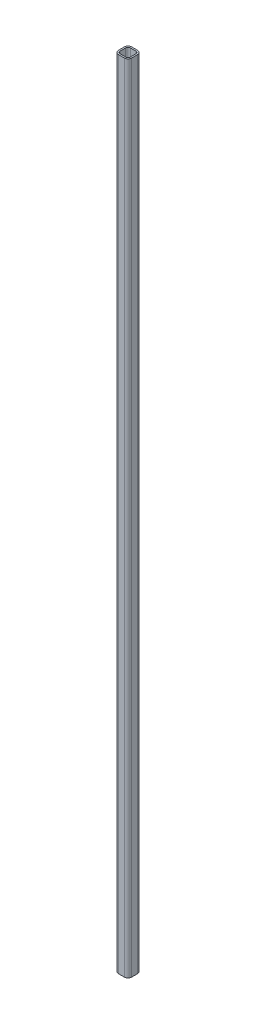
ISO-10303-21;
HEADER;
FILE_DESCRIPTION(('STEP AP214'),'2;1');
FILE_NAME('part.step','',(''),(''),'','','');
FILE_SCHEMA(('AUTOMOTIVE_DESIGN { 1 0 10303 214 1 1 1 1 }'));
ENDSEC;
DATA;
#1=APPLICATION_CONTEXT('core data for automotive mechanical design processes');
#2=APPLICATION_PROTOCOL_DEFINITION('international standard','automotive_design',2000,#1);
#3=PRODUCT_CONTEXT('',#1,'mechanical');
#4=PRODUCT('Part','Part','',(#3));
#5=PRODUCT_RELATED_PRODUCT_CATEGORY('part','',(#4));
#6=PRODUCT_DEFINITION_FORMATION('','',#4);
#7=PRODUCT_DEFINITION_CONTEXT('part definition',#1,'design');
#8=PRODUCT_DEFINITION('design','',#6,#7);
#9=PRODUCT_DEFINITION_SHAPE('','',#8);
#10=(LENGTH_UNIT() NAMED_UNIT(*) SI_UNIT(.MILLI.,.METRE.));
#11=(NAMED_UNIT(*) PLANE_ANGLE_UNIT() SI_UNIT($,.RADIAN.));
#12=(NAMED_UNIT(*) SI_UNIT($,.STERADIAN.) SOLID_ANGLE_UNIT());
#13=UNCERTAINTY_MEASURE_WITH_UNIT(LENGTH_MEASURE(1.E-05),#10,'distance_accuracy_value','');
#14=(GEOMETRIC_REPRESENTATION_CONTEXT(3) GLOBAL_UNCERTAINTY_ASSIGNED_CONTEXT((#13)) GLOBAL_UNIT_ASSIGNED_CONTEXT((#10,
#11,#12)) REPRESENTATION_CONTEXT('',''));
#15=CARTESIAN_POINT('',(0.,0.,0.));
#16=DIRECTION('',(0.,0.,1.));
#17=DIRECTION('',(1.,0.,0.));
#18=AXIS2_PLACEMENT_3D('',#15,#16,#17);
#19=CARTESIAN_POINT('',(11.,-90.,-11.));
#20=DIRECTION('',(1.,0.,0.));
#21=DIRECTION('',(0.,0.,-1.));
#22=AXIS2_PLACEMENT_3D('',#19,#20,#21);
#23=PLANE('',#22);
#24=DIRECTION('',(0.,0.,-1.));
#25=VECTOR('',#24,1.);
#26=CARTESIAN_POINT('',(11.,1100.,-11.));
#27=LINE('',#26,#25);
#28=CARTESIAN_POINT('',(11.,1100.,5.));
#29=VERTEX_POINT('',#28);
#30=CARTESIAN_POINT('',(11.,1100.,-5.));
#31=VERTEX_POINT('',#30);
#32=EDGE_CURVE('E329',#29,#31,#27,.T.);
#33=ORIENTED_EDGE('',*,*,#32,.F.);
#34=DIRECTION('',(0.,1.,0.));
#35=VECTOR('',#34,1.);
#36=CARTESIAN_POINT('',(11.,-90.,5.));
#37=LINE('',#36,#35);
#38=CARTESIAN_POINT('',(11.,-220.,5.));
#39=VERTEX_POINT('',#38);
#40=EDGE_CURVE('E219',#29,#39,#37,.F.);
#41=ORIENTED_EDGE('',*,*,#40,.T.);
#42=DIRECTION('',(0.,0.,1.));
#43=VECTOR('',#42,1.);
#44=CARTESIAN_POINT('',(11.,-220.,11.));
#45=LINE('',#44,#43);
#46=CARTESIAN_POINT('',(11.,-220.,-5.));
#47=VERTEX_POINT('',#46);
#48=EDGE_CURVE('E321',#47,#39,#45,.T.);
#49=ORIENTED_EDGE('',*,*,#48,.F.);
#50=DIRECTION('',(0.,1.,0.));
#51=VECTOR('',#50,1.);
#52=CARTESIAN_POINT('',(11.,-90.,-5.));
#53=LINE('',#52,#51);
#54=EDGE_CURVE('E215',#47,#31,#53,.T.);
#55=ORIENTED_EDGE('',*,*,#54,.T.);
#56=EDGE_LOOP('',(#33,#41,#49,#55));
#57=FACE_BOUND('',#56,.T.);
#58=ADVANCED_FACE('F39',(#57),#23,.T.);
#59=CARTESIAN_POINT('',(-11.,-90.,11.));
#60=DIRECTION('',(0.,0.,1.));
#61=DIRECTION('',(1.,0.,0.));
#62=AXIS2_PLACEMENT_3D('',#59,#60,#61);
#63=PLANE('',#62);
#64=DIRECTION('',(1.,0.,0.));
#65=VECTOR('',#64,1.);
#66=CARTESIAN_POINT('',(-11.,1100.,11.));
#67=LINE('',#66,#65);
#68=CARTESIAN_POINT('',(-5.,1100.,11.));
#69=VERTEX_POINT('',#68);
#70=CARTESIAN_POINT('',(5.,1100.,11.));
#71=VERTEX_POINT('',#70);
#72=EDGE_CURVE('E177',#69,#71,#67,.T.);
#73=ORIENTED_EDGE('',*,*,#72,.F.);
#74=DIRECTION('',(0.,1.,0.));
#75=VECTOR('',#74,1.);
#76=CARTESIAN_POINT('',(-5.,-90.,11.));
#77=LINE('',#76,#75);
#78=CARTESIAN_POINT('',(-5.,-220.,11.));
#79=VERTEX_POINT('',#78);
#80=EDGE_CURVE('E201',#69,#79,#77,.F.);
#81=ORIENTED_EDGE('',*,*,#80,.T.);
#82=DIRECTION('',(-1.,0.,0.));
#83=VECTOR('',#82,1.);
#84=CARTESIAN_POINT('',(-11.,-220.,11.));
#85=LINE('',#84,#83);
#86=CARTESIAN_POINT('',(5.,-220.,11.));
#87=VERTEX_POINT('',#86);
#88=EDGE_CURVE('E325',#87,#79,#85,.T.);
#89=ORIENTED_EDGE('',*,*,#88,.F.);
#90=DIRECTION('',(0.,1.,0.));
#91=VECTOR('',#90,1.);
#92=CARTESIAN_POINT('',(5.,-90.,11.));
#93=LINE('',#92,#91);
#94=EDGE_CURVE('E197',#87,#71,#93,.T.);
#95=ORIENTED_EDGE('',*,*,#94,.T.);
#96=EDGE_LOOP('',(#73,#81,#89,#95));
#97=FACE_BOUND('',#96,.T.);
#98=ADVANCED_FACE('F347',(#97),#63,.T.);
#99=CARTESIAN_POINT('',(-11.,-90.,-11.));
#100=DIRECTION('',(-1.,0.,0.));
#101=DIRECTION('',(0.,0.,1.));
#102=AXIS2_PLACEMENT_3D('',#99,#100,#101);
#103=PLANE('',#102);
#104=DIRECTION('',(0.,0.,-1.));
#105=VECTOR('',#104,1.);
#106=CARTESIAN_POINT('',(-11.,-220.,11.));
#107=LINE('',#106,#105);
#108=CARTESIAN_POINT('',(-11.,-220.,4.99999999999999));
#109=VERTEX_POINT('',#108);
#110=CARTESIAN_POINT('',(-11.,-220.,-5.));
#111=VERTEX_POINT('',#110);
#112=EDGE_CURVE('E298',#109,#111,#107,.T.);
#113=ORIENTED_EDGE('',*,*,#112,.F.);
#114=DIRECTION('',(0.,1.,0.));
#115=VECTOR('',#114,1.);
#116=CARTESIAN_POINT('',(-11.,-90.,5.));
#117=LINE('',#116,#115);
#118=CARTESIAN_POINT('',(-11.,1100.,5.));
#119=VERTEX_POINT('',#118);
#120=EDGE_CURVE('E175',#109,#119,#117,.T.);
#121=ORIENTED_EDGE('',*,*,#120,.T.);
#122=DIRECTION('',(0.,0.,1.));
#123=VECTOR('',#122,1.);
#124=CARTESIAN_POINT('',(-11.,1100.,-11.));
#125=LINE('',#124,#123);
#126=CARTESIAN_POINT('',(-11.,1100.,-5.));
#127=VERTEX_POINT('',#126);
#128=EDGE_CURVE('E157',#127,#119,#125,.T.);
#129=ORIENTED_EDGE('',*,*,#128,.F.);
#130=DIRECTION('',(0.,1.,0.));
#131=VECTOR('',#130,1.);
#132=CARTESIAN_POINT('',(-11.,-90.,-5.));
#133=LINE('',#132,#131);
#134=EDGE_CURVE('E172',#127,#111,#133,.F.);
#135=ORIENTED_EDGE('',*,*,#134,.T.);
#136=EDGE_LOOP('',(#113,#121,#129,#135));
#137=FACE_BOUND('',#136,.T.);
#138=ADVANCED_FACE('F171',(#137),#103,.T.);
#139=CARTESIAN_POINT('',(-11.,-90.,-11.));
#140=DIRECTION('',(0.,0.,-1.));
#141=DIRECTION('',(-1.,0.,0.));
#142=AXIS2_PLACEMENT_3D('',#139,#140,#141);
#143=PLANE('',#142);
#144=DIRECTION('',(1.,0.,0.));
#145=VECTOR('',#144,1.);
#146=CARTESIAN_POINT('',(-11.,-220.,-11.));
#147=LINE('',#146,#145);
#148=CARTESIAN_POINT('',(-5.,-220.,-11.));
#149=VERTEX_POINT('',#148);
#150=CARTESIAN_POINT('',(5.,-220.,-11.));
#151=VERTEX_POINT('',#150);
#152=EDGE_CURVE('E302',#149,#151,#147,.T.);
#153=ORIENTED_EDGE('',*,*,#152,.F.);
#154=DIRECTION('',(0.,1.,0.));
#155=VECTOR('',#154,1.);
#156=CARTESIAN_POINT('',(-5.,-90.,-11.));
#157=LINE('',#156,#155);
#158=CARTESIAN_POINT('',(-5.,1100.,-11.));
#159=VERTEX_POINT('',#158);
#160=EDGE_CURVE('E225',#149,#159,#157,.T.);
#161=ORIENTED_EDGE('',*,*,#160,.T.);
#162=DIRECTION('',(-1.,0.,0.));
#163=VECTOR('',#162,1.);
#164=CARTESIAN_POINT('',(-11.,1100.,-11.));
#165=LINE('',#164,#163);
#166=CARTESIAN_POINT('',(5.,1100.,-11.));
#167=VERTEX_POINT('',#166);
#168=EDGE_CURVE('E159',#167,#159,#165,.T.);
#169=ORIENTED_EDGE('',*,*,#168,.F.);
#170=DIRECTION('',(0.,1.,0.));
#171=VECTOR('',#170,1.);
#172=CARTESIAN_POINT('',(5.,-90.,-11.));
#173=LINE('',#172,#171);
#174=EDGE_CURVE('E222',#167,#151,#173,.F.);
#175=ORIENTED_EDGE('',*,*,#174,.T.);
#176=EDGE_LOOP('',(#153,#161,#169,#175));
#177=FACE_BOUND('',#176,.T.);
#178=ADVANCED_FACE('F354',(#177),#143,.T.);
#179=CARTESIAN_POINT('',(0.,1100.,0.));
#180=DIRECTION('',(0.,1.,0.));
#181=DIRECTION('',(0.,0.,1.));
#182=AXIS2_PLACEMENT_3D('',#179,#180,#181);
#183=PLANE('',#182);
#184=DIRECTION('',(1.,0.,0.));
#185=VECTOR('',#184,1.);
#186=CARTESIAN_POINT('',(-8.5,1100.,-8.5));
#187=LINE('',#186,#185);
#188=CARTESIAN_POINT('',(-4.5,1100.,-8.5));
#189=VERTEX_POINT('',#188);
#190=CARTESIAN_POINT('',(4.5,1100.,-8.5));
#191=VERTEX_POINT('',#190);
#192=EDGE_CURVE('E291',#189,#191,#187,.T.);
#193=ORIENTED_EDGE('',*,*,#192,.T.);
#194=CARTESIAN_POINT('',(4.5,1100.,-4.5));
#195=DIRECTION('',(0.,1.,0.));
#196=DIRECTION('',(0.,0.,1.));
#197=AXIS2_PLACEMENT_3D('',#194,#195,#196);
#198=CIRCLE('',#197,4.);
#199=CARTESIAN_POINT('',(8.5,1100.,-4.5));
#200=VERTEX_POINT('',#199);
#201=EDGE_CURVE('E258',#191,#200,#198,.F.);
#202=ORIENTED_EDGE('',*,*,#201,.T.);
#203=DIRECTION('',(0.,0.,1.));
#204=VECTOR('',#203,1.);
#205=CARTESIAN_POINT('',(8.5,1100.,8.5));
#206=LINE('',#205,#204);
#207=CARTESIAN_POINT('',(8.5,1100.,4.5));
#208=VERTEX_POINT('',#207);
#209=EDGE_CURVE('E316',#200,#208,#206,.T.);
#210=ORIENTED_EDGE('',*,*,#209,.T.);
#211=CARTESIAN_POINT('',(4.5,1100.,4.5));
#212=DIRECTION('',(0.,1.,0.));
#213=DIRECTION('',(0.,0.,1.));
#214=AXIS2_PLACEMENT_3D('',#211,#212,#213);
#215=CIRCLE('',#214,4.);
#216=CARTESIAN_POINT('',(4.5,1100.,8.5));
#217=VERTEX_POINT('',#216);
#218=EDGE_CURVE('E264',#208,#217,#215,.F.);
#219=ORIENTED_EDGE('',*,*,#218,.T.);
#220=DIRECTION('',(-1.,0.,0.));
#221=VECTOR('',#220,1.);
#222=CARTESIAN_POINT('',(-8.5,1100.,8.5));
#223=LINE('',#222,#221);
#224=CARTESIAN_POINT('',(-4.5,1100.,8.5));
#225=VERTEX_POINT('',#224);
#226=EDGE_CURVE('E304',#217,#225,#223,.T.);
#227=ORIENTED_EDGE('',*,*,#226,.T.);
#228=CARTESIAN_POINT('',(-4.5,1100.,4.5));
#229=DIRECTION('',(0.,1.,0.));
#230=DIRECTION('',(0.,0.,1.));
#231=AXIS2_PLACEMENT_3D('',#228,#229,#230);
#232=CIRCLE('',#231,4.);
#233=CARTESIAN_POINT('',(-8.5,1100.,4.5));
#234=VERTEX_POINT('',#233);
#235=EDGE_CURVE('E62',#225,#234,#232,.F.);
#236=ORIENTED_EDGE('',*,*,#235,.T.);
#237=DIRECTION('',(0.,0.,-1.));
#238=VECTOR('',#237,1.);
#239=CARTESIAN_POINT('',(-8.5,1100.,8.5));
#240=LINE('',#239,#238);
#241=CARTESIAN_POINT('',(-8.5,1100.,-4.5));
#242=VERTEX_POINT('',#241);
#243=EDGE_CURVE('E293',#234,#242,#240,.T.);
#244=ORIENTED_EDGE('',*,*,#243,.T.);
#245=CARTESIAN_POINT('',(-4.5,1100.,-4.5));
#246=DIRECTION('',(0.,1.,0.));
#247=DIRECTION('',(0.,0.,1.));
#248=AXIS2_PLACEMENT_3D('',#245,#246,#247);
#249=CIRCLE('',#248,4.);
#250=EDGE_CURVE('E11',#242,#189,#249,.F.);
#251=ORIENTED_EDGE('',*,*,#250,.T.);
#252=EDGE_LOOP('',(#193,#202,#210,#219,#227,#236,#244,#251));
#253=FACE_BOUND('',#252,.T.);
#254=ORIENTED_EDGE('',*,*,#128,.T.);
#255=CARTESIAN_POINT('',(-5.,1100.,4.99999999999999));
#256=DIRECTION('',(0.,1.,0.));
#257=DIRECTION('',(0.,0.,1.));
#258=AXIS2_PLACEMENT_3D('',#255,#256,#257);
#259=CIRCLE('',#258,6.);
#260=EDGE_CURVE('E194',#119,#69,#259,.T.);
#261=ORIENTED_EDGE('',*,*,#260,.T.);
#262=ORIENTED_EDGE('',*,*,#72,.T.);
#263=CARTESIAN_POINT('',(5.,1100.,5.));
#264=DIRECTION('',(0.,1.,0.));
#265=DIRECTION('',(0.,0.,1.));
#266=AXIS2_PLACEMENT_3D('',#263,#264,#265);
#267=CIRCLE('',#266,6.);
#268=EDGE_CURVE('E165',#71,#29,#267,.T.);
#269=ORIENTED_EDGE('',*,*,#268,.T.);
#270=ORIENTED_EDGE('',*,*,#32,.T.);
#271=CARTESIAN_POINT('',(5.,1100.,-5.));
#272=DIRECTION('',(0.,1.,0.));
#273=DIRECTION('',(0.,0.,1.));
#274=AXIS2_PLACEMENT_3D('',#271,#272,#273);
#275=CIRCLE('',#274,6.);
#276=EDGE_CURVE('E166',#31,#167,#275,.T.);
#277=ORIENTED_EDGE('',*,*,#276,.T.);
#278=ORIENTED_EDGE('',*,*,#168,.T.);
#279=CARTESIAN_POINT('',(-5.,1100.,-5.));
#280=DIRECTION('',(0.,1.,0.));
#281=DIRECTION('',(0.,0.,1.));
#282=AXIS2_PLACEMENT_3D('',#279,#280,#281);
#283=CIRCLE('',#282,6.);
#284=EDGE_CURVE('E154',#159,#127,#283,.T.);
#285=ORIENTED_EDGE('',*,*,#284,.T.);
#286=EDGE_LOOP('',(#254,#261,#262,#269,#270,#277,#278,#285));
#287=FACE_BOUND('',#286,.T.);
#288=ADVANCED_FACE('F156',(#253,#287),#183,.T.);
#289=CARTESIAN_POINT('',(0.,-220.,0.));
#290=DIRECTION('',(0.,-1.,0.));
#291=DIRECTION('',(0.,0.,-1.));
#292=AXIS2_PLACEMENT_3D('',#289,#290,#291);
#293=PLANE('',#292);
#294=DIRECTION('',(0.,0.,1.));
#295=VECTOR('',#294,1.);
#296=CARTESIAN_POINT('',(8.5,-220.,8.5));
#297=LINE('',#296,#295);
#298=CARTESIAN_POINT('',(8.5,-220.,-4.5));
#299=VERTEX_POINT('',#298);
#300=CARTESIAN_POINT('',(8.5,-220.,4.5));
#301=VERTEX_POINT('',#300);
#302=EDGE_CURVE('E308',#299,#301,#297,.T.);
#303=ORIENTED_EDGE('',*,*,#302,.F.);
#304=CARTESIAN_POINT('',(4.5,-220.,-4.5));
#305=DIRECTION('',(0.,-1.,0.));
#306=DIRECTION('',(0.,0.,-1.));
#307=AXIS2_PLACEMENT_3D('',#304,#305,#306);
#308=CIRCLE('',#307,4.);
#309=CARTESIAN_POINT('',(4.5,-220.,-8.5));
#310=VERTEX_POINT('',#309);
#311=EDGE_CURVE('E255',#299,#310,#308,.F.);
#312=ORIENTED_EDGE('',*,*,#311,.T.);
#313=DIRECTION('',(1.,0.,0.));
#314=VECTOR('',#313,1.);
#315=CARTESIAN_POINT('',(-8.5,-220.,-8.5));
#316=LINE('',#315,#314);
#317=CARTESIAN_POINT('',(-4.5,-220.,-8.5));
#318=VERTEX_POINT('',#317);
#319=EDGE_CURVE('E280',#318,#310,#316,.T.);
#320=ORIENTED_EDGE('',*,*,#319,.F.);
#321=CARTESIAN_POINT('',(-4.5,-220.,-4.5));
#322=DIRECTION('',(0.,-1.,0.));
#323=DIRECTION('',(0.,0.,-1.));
#324=AXIS2_PLACEMENT_3D('',#321,#322,#323);
#325=CIRCLE('',#324,4.);
#326=CARTESIAN_POINT('',(-8.5,-220.,-4.5));
#327=VERTEX_POINT('',#326);
#328=EDGE_CURVE('E48',#318,#327,#325,.F.);
#329=ORIENTED_EDGE('',*,*,#328,.T.);
#330=DIRECTION('',(0.,0.,-1.));
#331=VECTOR('',#330,1.);
#332=CARTESIAN_POINT('',(-8.5,-220.,8.5));
#333=LINE('',#332,#331);
#334=CARTESIAN_POINT('',(-8.5,-220.,4.5));
#335=VERTEX_POINT('',#334);
#336=EDGE_CURVE('E278',#335,#327,#333,.T.);
#337=ORIENTED_EDGE('',*,*,#336,.F.);
#338=CARTESIAN_POINT('',(-4.5,-220.,4.5));
#339=DIRECTION('',(0.,-1.,0.));
#340=DIRECTION('',(0.,0.,-1.));
#341=AXIS2_PLACEMENT_3D('',#338,#339,#340);
#342=CIRCLE('',#341,4.);
#343=CARTESIAN_POINT('',(-4.5,-220.,8.5));
#344=VERTEX_POINT('',#343);
#345=EDGE_CURVE('E267',#335,#344,#342,.F.);
#346=ORIENTED_EDGE('',*,*,#345,.T.);
#347=DIRECTION('',(-1.,0.,0.));
#348=VECTOR('',#347,1.);
#349=CARTESIAN_POINT('',(-8.5,-220.,8.5));
#350=LINE('',#349,#348);
#351=CARTESIAN_POINT('',(4.5,-220.,8.5));
#352=VERTEX_POINT('',#351);
#353=EDGE_CURVE('E286',#352,#344,#350,.T.);
#354=ORIENTED_EDGE('',*,*,#353,.F.);
#355=CARTESIAN_POINT('',(4.5,-220.,4.5));
#356=DIRECTION('',(0.,-1.,0.));
#357=DIRECTION('',(0.,0.,-1.));
#358=AXIS2_PLACEMENT_3D('',#355,#356,#357);
#359=CIRCLE('',#358,4.);
#360=EDGE_CURVE('E261',#352,#301,#359,.F.);
#361=ORIENTED_EDGE('',*,*,#360,.T.);
#362=EDGE_LOOP('',(#303,#312,#320,#329,#337,#346,#354,#361));
#363=FACE_BOUND('',#362,.T.);
#364=ORIENTED_EDGE('',*,*,#88,.T.);
#365=CARTESIAN_POINT('',(-5.,-220.,4.99999999999999));
#366=DIRECTION('',(0.,-1.,0.));
#367=DIRECTION('',(0.,0.,-1.));
#368=AXIS2_PLACEMENT_3D('',#365,#366,#367);
#369=CIRCLE('',#368,6.);
#370=EDGE_CURVE('E212',#79,#109,#369,.T.);
#371=ORIENTED_EDGE('',*,*,#370,.T.);
#372=ORIENTED_EDGE('',*,*,#112,.T.);
#373=CARTESIAN_POINT('',(-5.,-220.,-5.));
#374=DIRECTION('',(0.,-1.,0.));
#375=DIRECTION('',(0.,0.,-1.));
#376=AXIS2_PLACEMENT_3D('',#373,#374,#375);
#377=CIRCLE('',#376,6.);
#378=EDGE_CURVE('E181',#111,#149,#377,.T.);
#379=ORIENTED_EDGE('',*,*,#378,.T.);
#380=ORIENTED_EDGE('',*,*,#152,.T.);
#381=CARTESIAN_POINT('',(5.,-220.,-5.));
#382=DIRECTION('',(0.,-1.,0.));
#383=DIRECTION('',(0.,0.,-1.));
#384=AXIS2_PLACEMENT_3D('',#381,#382,#383);
#385=CIRCLE('',#384,6.);
#386=EDGE_CURVE('E204',#151,#47,#385,.T.);
#387=ORIENTED_EDGE('',*,*,#386,.T.);
#388=ORIENTED_EDGE('',*,*,#48,.T.);
#389=CARTESIAN_POINT('',(5.,-220.,5.));
#390=DIRECTION('',(0.,-1.,0.));
#391=DIRECTION('',(0.,0.,-1.));
#392=AXIS2_PLACEMENT_3D('',#389,#390,#391);
#393=CIRCLE('',#392,6.);
#394=EDGE_CURVE('E209',#39,#87,#393,.T.);
#395=ORIENTED_EDGE('',*,*,#394,.T.);
#396=EDGE_LOOP('',(#364,#371,#372,#379,#380,#387,#388,#395));
#397=FACE_BOUND('',#396,.T.);
#398=ADVANCED_FACE('F276',(#363,#397),#293,.T.);
#399=CARTESIAN_POINT('',(8.5,1100.,8.5));
#400=DIRECTION('',(1.,0.,0.));
#401=DIRECTION('',(0.,0.,-1.));
#402=AXIS2_PLACEMENT_3D('',#399,#400,#401);
#403=PLANE('',#402);
#404=ORIENTED_EDGE('',*,*,#209,.F.);
#405=DIRECTION('',(0.,-1.,0.));
#406=VECTOR('',#405,1.);
#407=CARTESIAN_POINT('',(8.5,-220.,-4.5));
#408=LINE('',#407,#406);
#409=EDGE_CURVE('E231',#200,#299,#408,.T.);
#410=ORIENTED_EDGE('',*,*,#409,.T.);
#411=ORIENTED_EDGE('',*,*,#302,.T.);
#412=DIRECTION('',(0.,-1.,0.));
#413=VECTOR('',#412,1.);
#414=CARTESIAN_POINT('',(8.5,1100.,4.5));
#415=LINE('',#414,#413);
#416=EDGE_CURVE('E228',#301,#208,#415,.F.);
#417=ORIENTED_EDGE('',*,*,#416,.T.);
#418=EDGE_LOOP('',(#404,#410,#411,#417));
#419=FACE_BOUND('',#418,.T.);
#420=ADVANCED_FACE('F416',(#419),#403,.F.);
#421=CARTESIAN_POINT('',(-8.5,1100.,-8.5));
#422=DIRECTION('',(0.,0.,-1.));
#423=DIRECTION('',(-1.,0.,0.));
#424=AXIS2_PLACEMENT_3D('',#421,#422,#423);
#425=PLANE('',#424);
#426=ORIENTED_EDGE('',*,*,#319,.T.);
#427=DIRECTION('',(0.,-1.,0.));
#428=VECTOR('',#427,1.);
#429=CARTESIAN_POINT('',(4.5,1100.,-8.5));
#430=LINE('',#429,#428);
#431=EDGE_CURVE('E239',#310,#191,#430,.F.);
#432=ORIENTED_EDGE('',*,*,#431,.T.);
#433=ORIENTED_EDGE('',*,*,#192,.F.);
#434=DIRECTION('',(0.,-1.,0.));
#435=VECTOR('',#434,1.);
#436=CARTESIAN_POINT('',(-4.5,-220.,-8.5));
#437=LINE('',#436,#435);
#438=EDGE_CURVE('E235',#189,#318,#437,.T.);
#439=ORIENTED_EDGE('',*,*,#438,.T.);
#440=EDGE_LOOP('',(#426,#432,#433,#439));
#441=FACE_BOUND('',#440,.T.);
#442=ADVANCED_FACE('F295',(#441),#425,.F.);
#443=CARTESIAN_POINT('',(-8.5,1100.,8.5));
#444=DIRECTION('',(-1.,0.,0.));
#445=DIRECTION('',(0.,0.,1.));
#446=AXIS2_PLACEMENT_3D('',#443,#444,#445);
#447=PLANE('',#446);
#448=ORIENTED_EDGE('',*,*,#243,.F.);
#449=DIRECTION('',(0.,-1.,0.));
#450=VECTOR('',#449,1.);
#451=CARTESIAN_POINT('',(-8.5,-220.,4.5));
#452=LINE('',#451,#450);
#453=EDGE_CURVE('E251',#234,#335,#452,.T.);
#454=ORIENTED_EDGE('',*,*,#453,.T.);
#455=ORIENTED_EDGE('',*,*,#336,.T.);
#456=DIRECTION('',(0.,-1.,0.));
#457=VECTOR('',#456,1.);
#458=CARTESIAN_POINT('',(-8.5,1100.,-4.5));
#459=LINE('',#458,#457);
#460=EDGE_CURVE('E55',#327,#242,#459,.F.);
#461=ORIENTED_EDGE('',*,*,#460,.T.);
#462=EDGE_LOOP('',(#448,#454,#455,#461));
#463=FACE_BOUND('',#462,.T.);
#464=ADVANCED_FACE('F283',(#463),#447,.F.);
#465=CARTESIAN_POINT('',(-8.5,1100.,8.5));
#466=DIRECTION('',(0.,0.,1.));
#467=DIRECTION('',(1.,0.,0.));
#468=AXIS2_PLACEMENT_3D('',#465,#466,#467);
#469=PLANE('',#468);
#470=ORIENTED_EDGE('',*,*,#226,.F.);
#471=DIRECTION('',(0.,-1.,0.));
#472=VECTOR('',#471,1.);
#473=CARTESIAN_POINT('',(4.5,-220.,8.5));
#474=LINE('',#473,#472);
#475=EDGE_CURVE('E245',#217,#352,#474,.T.);
#476=ORIENTED_EDGE('',*,*,#475,.T.);
#477=ORIENTED_EDGE('',*,*,#353,.T.);
#478=DIRECTION('',(0.,-1.,0.));
#479=VECTOR('',#478,1.);
#480=CARTESIAN_POINT('',(-4.5,1100.,8.5));
#481=LINE('',#480,#479);
#482=EDGE_CURVE('E242',#344,#225,#481,.F.);
#483=ORIENTED_EDGE('',*,*,#482,.T.);
#484=EDGE_LOOP('',(#470,#476,#477,#483));
#485=FACE_BOUND('',#484,.T.);
#486=ADVANCED_FACE('F380',(#485),#469,.F.);
#487=CARTESIAN_POINT('',(-5.,-90.,4.99999999999999));
#488=DIRECTION('',(0.,1.,0.));
#489=DIRECTION('',(0.,0.,1.));
#490=AXIS2_PLACEMENT_3D('',#487,#488,#489);
#491=CYLINDRICAL_SURFACE('',#490,6.);
#492=ORIENTED_EDGE('',*,*,#370,.F.);
#493=ORIENTED_EDGE('',*,*,#80,.F.);
#494=ORIENTED_EDGE('',*,*,#260,.F.);
#495=ORIENTED_EDGE('',*,*,#120,.F.);
#496=EDGE_LOOP('',(#492,#493,#494,#495));
#497=FACE_BOUND('',#496,.T.);
#498=ADVANCED_FACE('F350',(#497),#491,.T.);
#499=CARTESIAN_POINT('',(5.,-90.,5.));
#500=DIRECTION('',(0.,1.,0.));
#501=DIRECTION('',(0.,0.,1.));
#502=AXIS2_PLACEMENT_3D('',#499,#500,#501);
#503=CYLINDRICAL_SURFACE('',#502,6.);
#504=ORIENTED_EDGE('',*,*,#394,.F.);
#505=ORIENTED_EDGE('',*,*,#40,.F.);
#506=ORIENTED_EDGE('',*,*,#268,.F.);
#507=ORIENTED_EDGE('',*,*,#94,.F.);
#508=EDGE_LOOP('',(#504,#505,#506,#507));
#509=FACE_BOUND('',#508,.T.);
#510=ADVANCED_FACE('F341',(#509),#503,.T.);
#511=CARTESIAN_POINT('',(-5.,-90.,-5.));
#512=DIRECTION('',(0.,1.,0.));
#513=DIRECTION('',(0.,0.,1.));
#514=AXIS2_PLACEMENT_3D('',#511,#512,#513);
#515=CYLINDRICAL_SURFACE('',#514,6.);
#516=ORIENTED_EDGE('',*,*,#378,.F.);
#517=ORIENTED_EDGE('',*,*,#134,.F.);
#518=ORIENTED_EDGE('',*,*,#284,.F.);
#519=ORIENTED_EDGE('',*,*,#160,.F.);
#520=EDGE_LOOP('',(#516,#517,#518,#519));
#521=FACE_BOUND('',#520,.T.);
#522=ADVANCED_FACE('F180',(#521),#515,.T.);
#523=CARTESIAN_POINT('',(5.,-90.,-5.));
#524=DIRECTION('',(0.,1.,0.));
#525=DIRECTION('',(0.,0.,1.));
#526=AXIS2_PLACEMENT_3D('',#523,#524,#525);
#527=CYLINDRICAL_SURFACE('',#526,6.);
#528=ORIENTED_EDGE('',*,*,#386,.F.);
#529=ORIENTED_EDGE('',*,*,#174,.F.);
#530=ORIENTED_EDGE('',*,*,#276,.F.);
#531=ORIENTED_EDGE('',*,*,#54,.F.);
#532=EDGE_LOOP('',(#528,#529,#530,#531));
#533=FACE_BOUND('',#532,.T.);
#534=ADVANCED_FACE('F357',(#533),#527,.T.);
#535=CARTESIAN_POINT('',(4.5,1100.,-4.5));
#536=DIRECTION('',(0.,1.,0.));
#537=DIRECTION('',(0.,0.,1.));
#538=AXIS2_PLACEMENT_3D('',#535,#536,#537);
#539=CYLINDRICAL_SURFACE('',#538,4.);
#540=ORIENTED_EDGE('',*,*,#201,.F.);
#541=ORIENTED_EDGE('',*,*,#431,.F.);
#542=ORIENTED_EDGE('',*,*,#311,.F.);
#543=ORIENTED_EDGE('',*,*,#409,.F.);
#544=EDGE_LOOP('',(#540,#541,#542,#543));
#545=FACE_BOUND('',#544,.T.);
#546=ADVANCED_FACE('F359',(#545),#539,.F.);
#547=CARTESIAN_POINT('',(4.5,1100.,4.5));
#548=DIRECTION('',(0.,1.,0.));
#549=DIRECTION('',(0.,0.,1.));
#550=AXIS2_PLACEMENT_3D('',#547,#548,#549);
#551=CYLINDRICAL_SURFACE('',#550,4.);
#552=ORIENTED_EDGE('',*,*,#218,.F.);
#553=ORIENTED_EDGE('',*,*,#416,.F.);
#554=ORIENTED_EDGE('',*,*,#360,.F.);
#555=ORIENTED_EDGE('',*,*,#475,.F.);
#556=EDGE_LOOP('',(#552,#553,#554,#555));
#557=FACE_BOUND('',#556,.T.);
#558=ADVANCED_FACE('F365',(#557),#551,.F.);
#559=CARTESIAN_POINT('',(-4.5,1100.,4.5));
#560=DIRECTION('',(0.,1.,0.));
#561=DIRECTION('',(0.,0.,1.));
#562=AXIS2_PLACEMENT_3D('',#559,#560,#561);
#563=CYLINDRICAL_SURFACE('',#562,4.);
#564=ORIENTED_EDGE('',*,*,#235,.F.);
#565=ORIENTED_EDGE('',*,*,#482,.F.);
#566=ORIENTED_EDGE('',*,*,#345,.F.);
#567=ORIENTED_EDGE('',*,*,#453,.F.);
#568=EDGE_LOOP('',(#564,#565,#566,#567));
#569=FACE_BOUND('',#568,.T.);
#570=ADVANCED_FACE('F465',(#569),#563,.F.);
#571=CARTESIAN_POINT('',(-4.5,1100.,-4.5));
#572=DIRECTION('',(0.,1.,0.));
#573=DIRECTION('',(0.,0.,1.));
#574=AXIS2_PLACEMENT_3D('',#571,#572,#573);
#575=CYLINDRICAL_SURFACE('',#574,4.);
#576=ORIENTED_EDGE('',*,*,#250,.F.);
#577=ORIENTED_EDGE('',*,*,#460,.F.);
#578=ORIENTED_EDGE('',*,*,#328,.F.);
#579=ORIENTED_EDGE('',*,*,#438,.F.);
#580=EDGE_LOOP('',(#576,#577,#578,#579));
#581=FACE_BOUND('',#580,.T.);
#582=ADVANCED_FACE('F41',(#581),#575,.F.);
#583=CLOSED_SHELL('',(#58,#98,#138,#178,#288,#398,#420,#442,#464,#486,#498,#510,#522,#534,#546,
#558,#570,#582));
#584=MANIFOLD_SOLID_BREP('B2',#583);
#585=ADVANCED_BREP_SHAPE_REPRESENTATION('',(#18,#584),#14);
#586=SHAPE_DEFINITION_REPRESENTATION(#9,#585);
ENDSEC;
END-ISO-10303-21;
